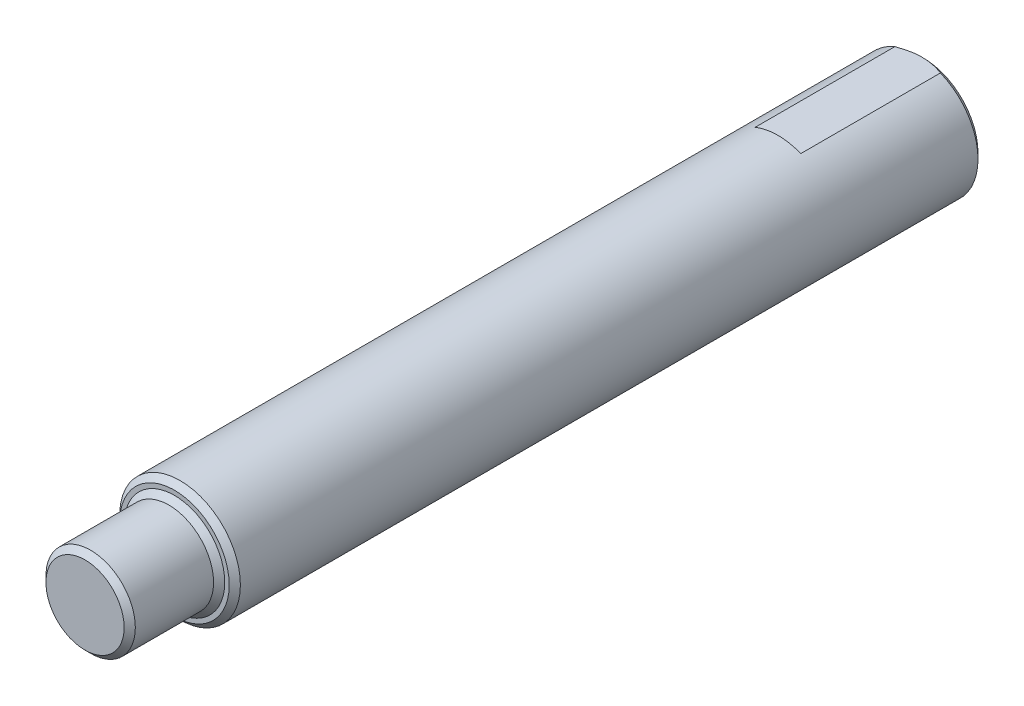
ISO-10303-21;
HEADER;
FILE_DESCRIPTION(('STEP AP214'),'2;1');
FILE_NAME('part.step','',(''),(''),'','','');
FILE_SCHEMA(('AUTOMOTIVE_DESIGN { 1 0 10303 214 1 1 1 1 }'));
ENDSEC;
DATA;
#1=APPLICATION_CONTEXT('core data for automotive mechanical design processes');
#2=APPLICATION_PROTOCOL_DEFINITION('international standard','automotive_design',2000,#1);
#3=PRODUCT_CONTEXT('',#1,'mechanical');
#4=PRODUCT('Part','Part','',(#3));
#5=PRODUCT_RELATED_PRODUCT_CATEGORY('part','',(#4));
#6=PRODUCT_DEFINITION_FORMATION('','',#4);
#7=PRODUCT_DEFINITION_CONTEXT('part definition',#1,'design');
#8=PRODUCT_DEFINITION('design','',#6,#7);
#9=PRODUCT_DEFINITION_SHAPE('','',#8);
#10=(LENGTH_UNIT() NAMED_UNIT(*) SI_UNIT(.MILLI.,.METRE.));
#11=(NAMED_UNIT(*) PLANE_ANGLE_UNIT() SI_UNIT($,.RADIAN.));
#12=(NAMED_UNIT(*) SI_UNIT($,.STERADIAN.) SOLID_ANGLE_UNIT());
#13=UNCERTAINTY_MEASURE_WITH_UNIT(LENGTH_MEASURE(1.E-05),#10,'distance_accuracy_value','');
#14=(GEOMETRIC_REPRESENTATION_CONTEXT(3) GLOBAL_UNCERTAINTY_ASSIGNED_CONTEXT((#13)) GLOBAL_UNIT_ASSIGNED_CONTEXT((#10,
#11,#12)) REPRESENTATION_CONTEXT('',''));
#15=CARTESIAN_POINT('',(0.,0.,0.));
#16=DIRECTION('',(0.,0.,1.));
#17=DIRECTION('',(1.,0.,0.));
#18=AXIS2_PLACEMENT_3D('',#15,#16,#17);
#19=CARTESIAN_POINT('',(0.,0.,67.));
#20=DIRECTION('',(0.,0.,-1.));
#21=DIRECTION('',(-1.,0.,0.));
#22=AXIS2_PLACEMENT_3D('',#19,#20,#21);
#23=CYLINDRICAL_SURFACE('',#22,5.4);
#24=CARTESIAN_POINT('',(0.,0.,66.5));
#25=DIRECTION('',(0.,0.,1.));
#26=DIRECTION('',(1.,0.,0.));
#27=AXIS2_PLACEMENT_3D('',#24,#25,#26);
#28=CIRCLE('',#27,5.4);
#29=CARTESIAN_POINT('',(5.4,0.,66.5));
#30=VERTEX_POINT('',#29);
#31=EDGE_CURVE('E110',#30,#30,#28,.F.);
#32=ORIENTED_EDGE('',*,*,#31,.T.);
#33=EDGE_LOOP('',(#32));
#34=FACE_BOUND('',#33,.T.);
#35=CARTESIAN_POINT('',(0.,0.,13.));
#36=DIRECTION('',(0.,0.,1.));
#37=DIRECTION('',(1.,0.,0.));
#38=AXIS2_PLACEMENT_3D('',#35,#36,#37);
#39=CIRCLE('',#38,5.4);
#40=CARTESIAN_POINT('',(-2.03960780543711,-5.,13.));
#41=VERTEX_POINT('',#40);
#42=CARTESIAN_POINT('',(2.03960780543711,-5.,13.));
#43=VERTEX_POINT('',#42);
#44=EDGE_CURVE('E85',#41,#43,#39,.T.);
#45=ORIENTED_EDGE('',*,*,#44,.T.);
#46=DIRECTION('',(0.,0.,-1.));
#47=VECTOR('',#46,1.);
#48=CARTESIAN_POINT('',(2.03960780543712,-5.,67.));
#49=LINE('',#48,#47);
#50=CARTESIAN_POINT('',(2.03960780543711,-5.,0.500000000000001));
#51=VERTEX_POINT('',#50);
#52=EDGE_CURVE('E91',#43,#51,#49,.T.);
#53=ORIENTED_EDGE('',*,*,#52,.T.);
#54=CARTESIAN_POINT('',(0.,0.,0.5));
#55=DIRECTION('',(0.,0.,1.));
#56=DIRECTION('',(1.,0.,0.));
#57=AXIS2_PLACEMENT_3D('',#54,#55,#56);
#58=CIRCLE('',#57,5.4);
#59=CARTESIAN_POINT('',(2.03960780543711,5.,0.5));
#60=VERTEX_POINT('',#59);
#61=EDGE_CURVE('E61',#51,#60,#58,.T.);
#62=ORIENTED_EDGE('',*,*,#61,.T.);
#63=DIRECTION('',(0.,0.,-1.));
#64=VECTOR('',#63,1.);
#65=CARTESIAN_POINT('',(2.03960780543712,5.,67.));
#66=LINE('',#65,#64);
#67=CARTESIAN_POINT('',(2.03960780543711,5.,13.));
#68=VERTEX_POINT('',#67);
#69=EDGE_CURVE('E105',#68,#60,#66,.T.);
#70=ORIENTED_EDGE('',*,*,#69,.F.);
#71=CARTESIAN_POINT('',(0.,0.,13.));
#72=DIRECTION('',(0.,0.,1.));
#73=DIRECTION('',(1.,0.,0.));
#74=AXIS2_PLACEMENT_3D('',#71,#72,#73);
#75=CIRCLE('',#74,5.4);
#76=CARTESIAN_POINT('',(-2.03960780543711,5.,13.));
#77=VERTEX_POINT('',#76);
#78=EDGE_CURVE('E141',#68,#77,#75,.T.);
#79=ORIENTED_EDGE('',*,*,#78,.T.);
#80=DIRECTION('',(0.,0.,-1.));
#81=VECTOR('',#80,1.);
#82=CARTESIAN_POINT('',(-2.03960780543712,5.,67.));
#83=LINE('',#82,#81);
#84=CARTESIAN_POINT('',(-2.03960780543711,5.,0.500000000000001));
#85=VERTEX_POINT('',#84);
#86=EDGE_CURVE('E103',#85,#77,#83,.F.);
#87=ORIENTED_EDGE('',*,*,#86,.F.);
#88=CARTESIAN_POINT('',(-2.03960780543711,-5.,0.5));
#89=VERTEX_POINT('',#88);
#90=EDGE_CURVE('E96',#85,#89,#58,.T.);
#91=ORIENTED_EDGE('',*,*,#90,.T.);
#92=DIRECTION('',(0.,0.,-1.));
#93=VECTOR('',#92,1.);
#94=CARTESIAN_POINT('',(-2.03960780543712,-5.,67.));
#95=LINE('',#94,#93);
#96=EDGE_CURVE('E53',#89,#41,#95,.F.);
#97=ORIENTED_EDGE('',*,*,#96,.T.);
#98=EDGE_LOOP('',(#45,#53,#62,#70,#79,#87,#91,#97));
#99=FACE_BOUND('',#98,.T.);
#100=ADVANCED_FACE('F38',(#34,#99),#23,.T.);
#101=CARTESIAN_POINT('',(0.,0.,0.5));
#102=DIRECTION('',(0.,0.,1.));
#103=DIRECTION('',(1.,0.,0.));
#104=AXIS2_PLACEMENT_3D('',#101,#102,#103);
#105=CONICAL_SURFACE('',#104,5.4,0.785398163397454);
#106=CARTESIAN_POINT('',(-3.55844793750584,-5.,1.23698229783494));
#107=CARTESIAN_POINT('',(-3.46862853281631,-5.,1.18490731578521));
#108=CARTESIAN_POINT('',(-3.37824708377923,-5.,1.13380360024076));
#109=CARTESIAN_POINT('',(-3.19623728614933,-5.,1.03381290104911));
#110=CARTESIAN_POINT('',(-3.10460862260932,-5.,0.984926491343643));
#111=CARTESIAN_POINT('',(-2.82702617390309,-5.,0.84167734532322));
#112=CARTESIAN_POINT('',(-2.63906658882333,-5.,0.75113053636076));
#113=CARTESIAN_POINT('',(-2.25426955084791,-5.,0.581916277053989));
#114=CARTESIAN_POINT('',(-2.05733888313538,-5.,0.503458458257276));
#115=CARTESIAN_POINT('',(-1.65751480131661,-5.,0.364256266708926));
#116=CARTESIAN_POINT('',(-1.4546319649387,-5.,0.303482344961021));
#117=CARTESIAN_POINT('',(-1.1246661128785,-5.,0.223502518929506));
#118=CARTESIAN_POINT('',(-0.999254136032923,-5.,0.197356244040855));
#119=CARTESIAN_POINT('',(-0.7468715711558,-5.,0.153946873610008));
#120=CARTESIAN_POINT('',(-0.619900907762321,-5.,0.136684209332923));
#121=CARTESIAN_POINT('',(-0.366074762066633,-5.,0.111805570168606));
#122=CARTESIAN_POINT('',(-0.239227094519324,-5.,0.104110605508209));
#123=CARTESIAN_POINT('',(0.0146882198085537,-5.,0.0984099621337332));
#124=CARTESIAN_POINT('',(0.141755871556905,-5.,0.100404505162543));
#125=CARTESIAN_POINT('',(0.414831894586559,-5.,0.115054400963581));
#126=CARTESIAN_POINT('',(0.560756443216524,-5.,0.129297800581304));
#127=CARTESIAN_POINT('',(0.850917867372856,-5.,0.169851883898826));
#128=CARTESIAN_POINT('',(0.995154397995772,-5.,0.196164991066865));
#129=CARTESIAN_POINT('',(1.28296336382972,-5.,0.260043725859941));
#130=CARTESIAN_POINT('',(1.42650538133625,-5.,0.297744851612287));
#131=CARTESIAN_POINT('',(1.71063388042911,-5.,0.382791524768694));
#132=CARTESIAN_POINT('',(1.85122096385269,-5.,0.430135086862981));
#133=CARTESIAN_POINT('',(2.17064155139047,-5.,0.548264489050556));
#134=CARTESIAN_POINT('',(2.34843963453479,-5.,0.62183722243253));
#135=CARTESIAN_POINT('',(2.69916966120003,-5.,0.779875127886671));
#136=CARTESIAN_POINT('',(2.87209891120536,-5.,0.864346190248952));
#137=CARTESIAN_POINT('',(3.2140915752397,-5.,1.04213553536569));
#138=CARTESIAN_POINT('',(3.38313912228285,-5.,1.13548410277971));
#139=CARTESIAN_POINT('',(3.71726244007848,-5.,1.32892384637747));
#140=CARTESIAN_POINT('',(3.88233894061287,-5.,1.42901377061601));
#141=CARTESIAN_POINT('',(4.20141944792188,-5.,1.62972307247471));
#142=CARTESIAN_POINT('',(4.35557911866465,-5.,1.73009626769987));
#143=CARTESIAN_POINT('',(4.66125946164198,-5.,1.93479801264585));
#144=CARTESIAN_POINT('',(4.81277991763847,-5.,2.03912688426204));
#145=CARTESIAN_POINT('',(5.11224654466357,-5.,2.25009416663372));
#146=CARTESIAN_POINT('',(5.26021226580976,-5.,2.35670492382208));
#147=CARTESIAN_POINT('',(5.5541632941286,-5.,2.57254212643726));
#148=CARTESIAN_POINT('',(5.7001491331678,-5.,2.68176784668037));
#149=CARTESIAN_POINT('',(5.84531484286481,-5.,2.79205470678773));
#150=B_SPLINE_CURVE_WITH_KNOTS('',3,(#106,#107,#108,#109,#110,#111,#112,#113,#114,#115,#116,
#117,#118,#119,#120,#121,#122,#123,#124,#125,#126,#127,#128,#129,#130,#131,#132,#133,#134,#135,
#136,#137,#138,#139,#140,#141,#142,#143,#144,#145,#146,#147,#148,#149),.UNSPECIFIED.,.F.,.F.,(4,
2,2,2,2,2,2,2,2,2,2,2,2,2,2,2,2,2,2,2,2,4),(0.,0.311458707648843,0.622997580473996,
1.24847571868561,1.88380812576863,2.51807274309483,2.90212477400918,3.28619544741344,
3.66707375996796,4.04796078890493,4.48726123245071,4.92664992146678,5.37148755985962,
5.81623370173474,6.39300615892292,6.97009166426407,7.54922173529127,8.12824455037756,
8.6800416751172,9.23188379943474,9.778969951991,10.3259061044888),.UNSPECIFIED.);
#151=EDGE_CURVE('E88',#89,#51,#150,.T.);
#152=ORIENTED_EDGE('',*,*,#151,.F.);
#153=ORIENTED_EDGE('',*,*,#90,.F.);
#154=CARTESIAN_POINT('',(-3.55844793750584,5.,1.23698229783494));
#155=CARTESIAN_POINT('',(-3.46862853281631,5.,1.18490731578521));
#156=CARTESIAN_POINT('',(-3.37824708377923,5.,1.13380360024076));
#157=CARTESIAN_POINT('',(-3.19623728614933,5.,1.03381290104911));
#158=CARTESIAN_POINT('',(-3.10460862260932,5.,0.984926491343643));
#159=CARTESIAN_POINT('',(-2.82702617390309,5.,0.84167734532322));
#160=CARTESIAN_POINT('',(-2.63906658882333,5.,0.75113053636076));
#161=CARTESIAN_POINT('',(-2.25426955084791,5.,0.581916277053989));
#162=CARTESIAN_POINT('',(-2.05733888313538,5.,0.503458458257276));
#163=CARTESIAN_POINT('',(-1.65751480131661,5.,0.364256266708926));
#164=CARTESIAN_POINT('',(-1.4546319649387,5.,0.303482344961021));
#165=CARTESIAN_POINT('',(-1.1246661128785,5.,0.223502518929506));
#166=CARTESIAN_POINT('',(-0.999254136032923,5.,0.197356244040855));
#167=CARTESIAN_POINT('',(-0.7468715711558,5.,0.153946873610008));
#168=CARTESIAN_POINT('',(-0.619900907762321,5.,0.136684209332923));
#169=CARTESIAN_POINT('',(-0.366074762066633,5.,0.111805570168606));
#170=CARTESIAN_POINT('',(-0.239227094519324,5.,0.104110605508209));
#171=CARTESIAN_POINT('',(0.0146882198085537,5.,0.0984099621337332));
#172=CARTESIAN_POINT('',(0.141755871556905,5.,0.100404505162543));
#173=CARTESIAN_POINT('',(0.414831894586559,5.,0.115054400963581));
#174=CARTESIAN_POINT('',(0.560756443216524,5.,0.129297800581304));
#175=CARTESIAN_POINT('',(0.850917867372856,5.,0.169851883898826));
#176=CARTESIAN_POINT('',(0.995154397995772,5.,0.196164991066865));
#177=CARTESIAN_POINT('',(1.28296336382972,5.,0.260043725859941));
#178=CARTESIAN_POINT('',(1.42650538133625,5.,0.297744851612287));
#179=CARTESIAN_POINT('',(1.71063388042911,5.,0.382791524768694));
#180=CARTESIAN_POINT('',(1.85122096385269,5.,0.430135086862981));
#181=CARTESIAN_POINT('',(2.17064155139047,5.,0.548264489050556));
#182=CARTESIAN_POINT('',(2.34843963453479,5.,0.62183722243253));
#183=CARTESIAN_POINT('',(2.69916966120003,5.,0.779875127886671));
#184=CARTESIAN_POINT('',(2.87209891120536,5.,0.864346190248952));
#185=CARTESIAN_POINT('',(3.2140915752397,5.,1.04213553536569));
#186=CARTESIAN_POINT('',(3.38313912228285,5.,1.13548410277971));
#187=CARTESIAN_POINT('',(3.71726244007848,5.,1.32892384637747));
#188=CARTESIAN_POINT('',(3.88233894061287,5.,1.42901377061601));
#189=CARTESIAN_POINT('',(4.20141944792188,5.,1.62972307247471));
#190=CARTESIAN_POINT('',(4.35557911866465,5.,1.73009626769987));
#191=CARTESIAN_POINT('',(4.66125946164198,5.,1.93479801264585));
#192=CARTESIAN_POINT('',(4.81277991763847,5.,2.03912688426204));
#193=CARTESIAN_POINT('',(5.11224654466357,5.,2.25009416663372));
#194=CARTESIAN_POINT('',(5.26021226580976,5.,2.35670492382208));
#195=CARTESIAN_POINT('',(5.5541632941286,5.,2.57254212643726));
#196=CARTESIAN_POINT('',(5.7001491331678,5.,2.68176784668037));
#197=CARTESIAN_POINT('',(5.84531484286481,5.,2.79205470678773));
#198=B_SPLINE_CURVE_WITH_KNOTS('',3,(#154,#155,#156,#157,#158,#159,#160,#161,#162,#163,#164,
#165,#166,#167,#168,#169,#170,#171,#172,#173,#174,#175,#176,#177,#178,#179,#180,#181,#182,#183,
#184,#185,#186,#187,#188,#189,#190,#191,#192,#193,#194,#195,#196,#197),.UNSPECIFIED.,.F.,.F.,(4,
2,2,2,2,2,2,2,2,2,2,2,2,2,2,2,2,2,2,2,2,4),(0.,0.311458707648843,0.622997580473996,
1.24847571868561,1.88380812576863,2.51807274309483,2.90212477400918,3.28619544741344,
3.66707375996796,4.04796078890493,4.48726123245071,4.92664992146678,5.37148755985962,
5.81623370173474,6.39300615892292,6.97009166426407,7.54922173529127,8.12824455037756,
8.6800416751172,9.23188379943474,9.778969951991,10.3259061044888),.UNSPECIFIED.);
#199=EDGE_CURVE('E132',#85,#60,#198,.T.);
#200=ORIENTED_EDGE('',*,*,#199,.T.);
#201=ORIENTED_EDGE('',*,*,#61,.F.);
#202=EDGE_LOOP('',(#152,#153,#200,#201));
#203=FACE_BOUND('',#202,.T.);
#204=CARTESIAN_POINT('',(0.,0.,0.));
#205=DIRECTION('',(0.,0.,1.));
#206=DIRECTION('',(1.,0.,0.));
#207=AXIS2_PLACEMENT_3D('',#204,#205,#206);
#208=CIRCLE('',#207,4.9);
#209=CARTESIAN_POINT('',(4.9,0.,0.));
#210=VERTEX_POINT('',#209);
#211=EDGE_CURVE('E114',#210,#210,#208,.F.);
#212=ORIENTED_EDGE('',*,*,#211,.F.);
#213=EDGE_LOOP('',(#212));
#214=FACE_BOUND('',#213,.T.);
#215=ADVANCED_FACE('F143',(#203,#214),#105,.T.);
#216=CARTESIAN_POINT('',(0.,0.,67.));
#217=DIRECTION('',(0.,0.,1.));
#218=DIRECTION('',(1.,0.,0.));
#219=AXIS2_PLACEMENT_3D('',#216,#217,#218);
#220=PLANE('',#219);
#221=CARTESIAN_POINT('',(0.,0.,67.));
#222=DIRECTION('',(0.,0.,1.));
#223=DIRECTION('',(1.,0.,0.));
#224=AXIS2_PLACEMENT_3D('',#221,#222,#223);
#225=CIRCLE('',#224,4.5);
#226=CARTESIAN_POINT('',(4.5,0.,67.));
#227=VERTEX_POINT('',#226);
#228=EDGE_CURVE('E11',#227,#227,#225,.F.);
#229=ORIENTED_EDGE('',*,*,#228,.T.);
#230=EDGE_LOOP('',(#229));
#231=FACE_BOUND('',#230,.T.);
#232=CARTESIAN_POINT('',(0.,0.,67.));
#233=DIRECTION('',(0.,0.,1.));
#234=DIRECTION('',(1.,0.,0.));
#235=AXIS2_PLACEMENT_3D('',#232,#233,#234);
#236=CIRCLE('',#235,4.89999999999999);
#237=CARTESIAN_POINT('',(4.89999999999999,0.,67.));
#238=VERTEX_POINT('',#237);
#239=EDGE_CURVE('E117',#238,#238,#236,.T.);
#240=ORIENTED_EDGE('',*,*,#239,.T.);
#241=EDGE_LOOP('',(#240));
#242=FACE_BOUND('',#241,.T.);
#243=ADVANCED_FACE('F174',(#231,#242),#220,.T.);
#244=CARTESIAN_POINT('',(0.,0.,0.));
#245=DIRECTION('',(0.,0.,1.));
#246=DIRECTION('',(1.,0.,0.));
#247=AXIS2_PLACEMENT_3D('',#244,#245,#246);
#248=PLANE('',#247);
#249=CARTESIAN_POINT('',(0.,0.,0.));
#250=DIRECTION('',(0.,0.,1.));
#251=DIRECTION('',(1.,0.,0.));
#252=AXIS2_PLACEMENT_3D('',#249,#250,#251);
#253=CIRCLE('',#252,2.6);
#254=CARTESIAN_POINT('',(2.6,0.,0.));
#255=VERTEX_POINT('',#254);
#256=EDGE_CURVE('E129',#255,#255,#253,.T.);
#257=ORIENTED_EDGE('',*,*,#256,.T.);
#258=EDGE_LOOP('',(#257));
#259=FACE_BOUND('',#258,.T.);
#260=ORIENTED_EDGE('',*,*,#211,.T.);
#261=EDGE_LOOP('',(#260));
#262=FACE_BOUND('',#261,.T.);
#263=ADVANCED_FACE('F177',(#259,#262),#248,.F.);
#264=CARTESIAN_POINT('',(0.,0.,67.));
#265=DIRECTION('',(0.,0.,-1.));
#266=DIRECTION('',(-1.,0.,0.));
#267=AXIS2_PLACEMENT_3D('',#264,#265,#266);
#268=CONICAL_SURFACE('',#267,4.89999999999999,0.785398163397447);
#269=ORIENTED_EDGE('',*,*,#31,.F.);
#270=EDGE_LOOP('',(#269));
#271=FACE_BOUND('',#270,.T.);
#272=ORIENTED_EDGE('',*,*,#239,.F.);
#273=EDGE_LOOP('',(#272));
#274=FACE_BOUND('',#273,.T.);
#275=ADVANCED_FACE('F172',(#271,#274),#268,.T.);
#276=CARTESIAN_POINT('',(0.,0.,75.));
#277=DIRECTION('',(0.,0.,-1.));
#278=DIRECTION('',(-1.,0.,0.));
#279=AXIS2_PLACEMENT_3D('',#276,#277,#278);
#280=CYLINDRICAL_SURFACE('',#279,4.);
#281=CARTESIAN_POINT('',(0.,0.,67.5));
#282=DIRECTION('',(0.,0.,1.));
#283=DIRECTION('',(1.,0.,0.));
#284=AXIS2_PLACEMENT_3D('',#281,#282,#283);
#285=CIRCLE('',#284,4.);
#286=CARTESIAN_POINT('',(4.,0.,67.5));
#287=VERTEX_POINT('',#286);
#288=EDGE_CURVE('E46',#287,#287,#285,.T.);
#289=ORIENTED_EDGE('',*,*,#288,.T.);
#290=EDGE_LOOP('',(#289));
#291=FACE_BOUND('',#290,.T.);
#292=CARTESIAN_POINT('',(0.,0.,74.5));
#293=DIRECTION('',(0.,0.,1.));
#294=DIRECTION('',(1.,0.,0.));
#295=AXIS2_PLACEMENT_3D('',#292,#293,#294);
#296=CIRCLE('',#295,4.);
#297=CARTESIAN_POINT('',(4.,0.,74.5));
#298=VERTEX_POINT('',#297);
#299=EDGE_CURVE('E123',#298,#298,#296,.F.);
#300=ORIENTED_EDGE('',*,*,#299,.T.);
#301=EDGE_LOOP('',(#300));
#302=FACE_BOUND('',#301,.T.);
#303=ADVANCED_FACE('F168',(#291,#302),#280,.T.);
#304=CARTESIAN_POINT('',(0.,0.,75.));
#305=DIRECTION('',(0.,0.,1.));
#306=DIRECTION('',(1.,0.,0.));
#307=AXIS2_PLACEMENT_3D('',#304,#305,#306);
#308=PLANE('',#307);
#309=CARTESIAN_POINT('',(0.,0.,75.));
#310=DIRECTION('',(0.,0.,1.));
#311=DIRECTION('',(1.,0.,0.));
#312=AXIS2_PLACEMENT_3D('',#309,#310,#311);
#313=CIRCLE('',#312,3.5);
#314=CARTESIAN_POINT('',(3.5,0.,75.));
#315=VERTEX_POINT('',#314);
#316=EDGE_CURVE('E120',#315,#315,#313,.T.);
#317=ORIENTED_EDGE('',*,*,#316,.T.);
#318=EDGE_LOOP('',(#317));
#319=FACE_BOUND('',#318,.T.);
#320=ADVANCED_FACE('F165',(#319),#308,.T.);
#321=CARTESIAN_POINT('',(0.,0.,75.));
#322=DIRECTION('',(0.,0.,-1.));
#323=DIRECTION('',(-1.,0.,0.));
#324=AXIS2_PLACEMENT_3D('',#321,#322,#323);
#325=CONICAL_SURFACE('',#324,3.5,0.785398163397445);
#326=ORIENTED_EDGE('',*,*,#299,.F.);
#327=EDGE_LOOP('',(#326));
#328=FACE_BOUND('',#327,.T.);
#329=ORIENTED_EDGE('',*,*,#316,.F.);
#330=EDGE_LOOP('',(#329));
#331=FACE_BOUND('',#330,.T.);
#332=ADVANCED_FACE('F163',(#328,#331),#325,.T.);
#333=CARTESIAN_POINT('',(0.,0.,12.4));
#334=DIRECTION('',(0.,0.,-1.));
#335=DIRECTION('',(-1.,0.,0.));
#336=AXIS2_PLACEMENT_3D('',#333,#334,#335);
#337=CONICAL_SURFACE('',#336,2.1,1.02974425867665);
#338=CARTESIAN_POINT('',(0.,0.,13.6618072999579));
#339=VERTEX_POINT('',#338);
#340=VERTEX_LOOP('',#339);
#341=FACE_BOUND('',#340,.T.);
#342=CARTESIAN_POINT('',(0.,0.,12.4));
#343=DIRECTION('',(0.,0.,-1.));
#344=DIRECTION('',(-1.,0.,0.));
#345=AXIS2_PLACEMENT_3D('',#342,#343,#344);
#346=CIRCLE('',#345,2.1);
#347=CARTESIAN_POINT('',(-2.1,0.,12.4));
#348=VERTEX_POINT('',#347);
#349=EDGE_CURVE('E107',#348,#348,#346,.T.);
#350=ORIENTED_EDGE('',*,*,#349,.T.);
#351=EDGE_LOOP('',(#350));
#352=FACE_BOUND('',#351,.T.);
#353=ADVANCED_FACE('F159',(#341,#352),#337,.F.);
#354=CARTESIAN_POINT('',(0.,0.,0.));
#355=DIRECTION('',(0.,0.,-1.));
#356=DIRECTION('',(-1.,0.,0.));
#357=AXIS2_PLACEMENT_3D('',#354,#355,#356);
#358=CYLINDRICAL_SURFACE('',#357,2.1);
#359=CARTESIAN_POINT('',(0.,0.,0.499999999999993));
#360=DIRECTION('',(0.,0.,1.));
#361=DIRECTION('',(1.,0.,0.));
#362=AXIS2_PLACEMENT_3D('',#359,#360,#361);
#363=CIRCLE('',#362,2.1);
#364=CARTESIAN_POINT('',(2.1,0.,0.499999999999993));
#365=VERTEX_POINT('',#364);
#366=EDGE_CURVE('E126',#365,#365,#363,.F.);
#367=ORIENTED_EDGE('',*,*,#366,.T.);
#368=EDGE_LOOP('',(#367));
#369=FACE_BOUND('',#368,.T.);
#370=ORIENTED_EDGE('',*,*,#349,.F.);
#371=EDGE_LOOP('',(#370));
#372=FACE_BOUND('',#371,.T.);
#373=ADVANCED_FACE('F155',(#369,#372),#358,.F.);
#374=CARTESIAN_POINT('',(0.,0.,0.499999999999993));
#375=DIRECTION('',(0.,0.,-1.));
#376=DIRECTION('',(-1.,0.,0.));
#377=AXIS2_PLACEMENT_3D('',#374,#375,#376);
#378=CONICAL_SURFACE('',#377,2.1,0.785398163397455);
#379=ORIENTED_EDGE('',*,*,#256,.F.);
#380=EDGE_LOOP('',(#379));
#381=FACE_BOUND('',#380,.T.);
#382=ORIENTED_EDGE('',*,*,#366,.F.);
#383=EDGE_LOOP('',(#382));
#384=FACE_BOUND('',#383,.T.);
#385=ADVANCED_FACE('F158',(#381,#384),#378,.F.);
#386=CARTESIAN_POINT('',(-5.,5.,13.));
#387=DIRECTION('',(0.,0.,1.));
#388=DIRECTION('',(1.,0.,0.));
#389=AXIS2_PLACEMENT_3D('',#386,#387,#388);
#390=PLANE('',#389);
#391=DIRECTION('',(1.,0.,0.));
#392=VECTOR('',#391,1.);
#393=CARTESIAN_POINT('',(-5.,5.,13.));
#394=LINE('',#393,#392);
#395=EDGE_CURVE('E98',#77,#68,#394,.T.);
#396=ORIENTED_EDGE('',*,*,#395,.F.);
#397=ORIENTED_EDGE('',*,*,#78,.F.);
#398=EDGE_LOOP('',(#396,#397));
#399=FACE_BOUND('',#398,.T.);
#400=ADVANCED_FACE('F152',(#399),#390,.F.);
#401=CARTESIAN_POINT('',(-5.,5.,13.));
#402=DIRECTION('',(0.,1.,0.));
#403=DIRECTION('',(0.,0.,1.));
#404=AXIS2_PLACEMENT_3D('',#401,#402,#403);
#405=PLANE('',#404);
#406=ORIENTED_EDGE('',*,*,#69,.T.);
#407=ORIENTED_EDGE('',*,*,#199,.F.);
#408=ORIENTED_EDGE('',*,*,#86,.T.);
#409=ORIENTED_EDGE('',*,*,#395,.T.);
#410=EDGE_LOOP('',(#406,#407,#408,#409));
#411=FACE_BOUND('',#410,.T.);
#412=ADVANCED_FACE('F147',(#411),#405,.T.);
#413=CARTESIAN_POINT('',(-5.,-5.,13.));
#414=DIRECTION('',(0.,0.,1.));
#415=DIRECTION('',(1.,0.,0.));
#416=AXIS2_PLACEMENT_3D('',#413,#414,#415);
#417=PLANE('',#416);
#418=DIRECTION('',(1.,0.,0.));
#419=VECTOR('',#418,1.);
#420=CARTESIAN_POINT('',(-5.,-5.,13.));
#421=LINE('',#420,#419);
#422=EDGE_CURVE('E87',#41,#43,#421,.T.);
#423=ORIENTED_EDGE('',*,*,#422,.T.);
#424=ORIENTED_EDGE('',*,*,#44,.F.);
#425=EDGE_LOOP('',(#423,#424));
#426=FACE_BOUND('',#425,.T.);
#427=ADVANCED_FACE('F86',(#426),#417,.F.);
#428=CARTESIAN_POINT('',(-5.,-5.,13.));
#429=DIRECTION('',(0.,1.,0.));
#430=DIRECTION('',(0.,0.,1.));
#431=AXIS2_PLACEMENT_3D('',#428,#429,#430);
#432=PLANE('',#431);
#433=ORIENTED_EDGE('',*,*,#422,.F.);
#434=ORIENTED_EDGE('',*,*,#96,.F.);
#435=ORIENTED_EDGE('',*,*,#151,.T.);
#436=ORIENTED_EDGE('',*,*,#52,.F.);
#437=EDGE_LOOP('',(#433,#434,#435,#436));
#438=FACE_BOUND('',#437,.T.);
#439=ADVANCED_FACE('F90',(#438),#432,.F.);
#440=CARTESIAN_POINT('',(0.,0.,67.5));
#441=DIRECTION('',(0.,0.,-1.));
#442=DIRECTION('',(-1.,0.,0.));
#443=AXIS2_PLACEMENT_3D('',#440,#441,#442);
#444=CONICAL_SURFACE('',#443,4.,0.785398163397438);
#445=ORIENTED_EDGE('',*,*,#228,.F.);
#446=EDGE_LOOP('',(#445));
#447=FACE_BOUND('',#446,.T.);
#448=ORIENTED_EDGE('',*,*,#288,.F.);
#449=EDGE_LOOP('',(#448));
#450=FACE_BOUND('',#449,.T.);
#451=ADVANCED_FACE('F40',(#447,#450),#444,.T.);
#452=CLOSED_SHELL('',(#100,#215,#243,#263,#275,#303,#320,#332,#353,#373,#385,#400,#412,#427,
#439,#451));
#453=MANIFOLD_SOLID_BREP('B2',#452);
#454=ADVANCED_BREP_SHAPE_REPRESENTATION('',(#18,#453),#14);
#455=SHAPE_DEFINITION_REPRESENTATION(#9,#454);
ENDSEC;
END-ISO-10303-21;
